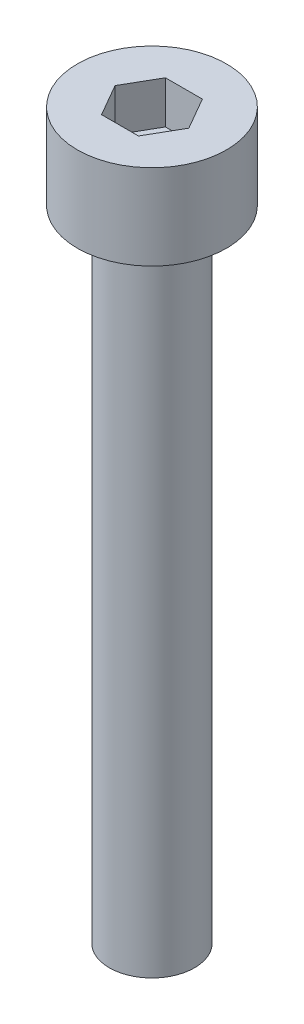
ISO-10303-21;
HEADER;
FILE_DESCRIPTION(('STEP AP214'),'2;1');
FILE_NAME('part.step','',(''),(''),'','','');
FILE_SCHEMA(('AUTOMOTIVE_DESIGN { 1 0 10303 214 1 1 1 1 }'));
ENDSEC;
DATA;
#1=APPLICATION_CONTEXT('core data for automotive mechanical design processes');
#2=APPLICATION_PROTOCOL_DEFINITION('international standard','automotive_design',2000,#1);
#3=PRODUCT_CONTEXT('',#1,'mechanical');
#4=PRODUCT('Part','Part','',(#3));
#5=PRODUCT_RELATED_PRODUCT_CATEGORY('part','',(#4));
#6=PRODUCT_DEFINITION_FORMATION('','',#4);
#7=PRODUCT_DEFINITION_CONTEXT('part definition',#1,'design');
#8=PRODUCT_DEFINITION('design','',#6,#7);
#9=PRODUCT_DEFINITION_SHAPE('','',#8);
#10=(LENGTH_UNIT() NAMED_UNIT(*) SI_UNIT(.MILLI.,.METRE.));
#11=(NAMED_UNIT(*) PLANE_ANGLE_UNIT() SI_UNIT($,.RADIAN.));
#12=(NAMED_UNIT(*) SI_UNIT($,.STERADIAN.) SOLID_ANGLE_UNIT());
#13=UNCERTAINTY_MEASURE_WITH_UNIT(LENGTH_MEASURE(1.E-05),#10,'distance_accuracy_value','');
#14=(GEOMETRIC_REPRESENTATION_CONTEXT(3) GLOBAL_UNCERTAINTY_ASSIGNED_CONTEXT((#13)) GLOBAL_UNIT_ASSIGNED_CONTEXT((#10,
#11,#12)) REPRESENTATION_CONTEXT('',''));
#15=CARTESIAN_POINT('',(0.,0.,0.));
#16=DIRECTION('',(0.,0.,1.));
#17=DIRECTION('',(1.,0.,0.));
#18=AXIS2_PLACEMENT_3D('',#15,#16,#17);
#19=CARTESIAN_POINT('',(0.,4.,0.));
#20=DIRECTION('',(0.,-1.,0.));
#21=DIRECTION('',(0.,0.,-1.));
#22=AXIS2_PLACEMENT_3D('',#19,#20,#21);
#23=PLANE('',#22);
#24=DIRECTION('',(-0.5,0.,-0.866025403784438));
#25=VECTOR('',#24,1.);
#26=CARTESIAN_POINT('',(1.73205080756888,4.,0.));
#27=LINE('',#26,#25);
#28=CARTESIAN_POINT('',(1.73205080756888,4.,0.));
#29=VERTEX_POINT('',#28);
#30=CARTESIAN_POINT('',(0.866025403784438,4.,-1.5));
#31=VERTEX_POINT('',#30);
#32=EDGE_CURVE('E122',#29,#31,#27,.T.);
#33=ORIENTED_EDGE('',*,*,#32,.F.);
#34=DIRECTION('',(0.5,0.,-0.866025403784439));
#35=VECTOR('',#34,1.);
#36=CARTESIAN_POINT('',(0.866025403784439,4.,1.5));
#37=LINE('',#36,#35);
#38=CARTESIAN_POINT('',(0.866025403784439,4.,1.5));
#39=VERTEX_POINT('',#38);
#40=EDGE_CURVE('E48',#39,#29,#37,.T.);
#41=ORIENTED_EDGE('',*,*,#40,.F.);
#42=DIRECTION('',(1.,0.,0.));
#43=VECTOR('',#42,1.);
#44=CARTESIAN_POINT('',(-0.866025403784439,4.,1.5));
#45=LINE('',#44,#43);
#46=CARTESIAN_POINT('',(-0.866025403784439,4.,1.5));
#47=VERTEX_POINT('',#46);
#48=EDGE_CURVE('E131',#47,#39,#45,.T.);
#49=ORIENTED_EDGE('',*,*,#48,.F.);
#50=DIRECTION('',(0.5,0.,0.866025403784439));
#51=VECTOR('',#50,1.);
#52=CARTESIAN_POINT('',(-1.73205080756888,4.,0.));
#53=LINE('',#52,#51);
#54=CARTESIAN_POINT('',(-1.73205080756888,4.,0.));
#55=VERTEX_POINT('',#54);
#56=EDGE_CURVE('E129',#55,#47,#53,.T.);
#57=ORIENTED_EDGE('',*,*,#56,.F.);
#58=DIRECTION('',(-0.5,0.,0.866025403784439));
#59=VECTOR('',#58,1.);
#60=CARTESIAN_POINT('',(-0.866025403784438,4.,-1.5));
#61=LINE('',#60,#59);
#62=CARTESIAN_POINT('',(-0.866025403784438,4.,-1.5));
#63=VERTEX_POINT('',#62);
#64=EDGE_CURVE('E96',#63,#55,#61,.T.);
#65=ORIENTED_EDGE('',*,*,#64,.F.);
#66=DIRECTION('',(-1.,0.,0.));
#67=VECTOR('',#66,1.);
#68=CARTESIAN_POINT('',(0.866025403784438,4.,-1.5));
#69=LINE('',#68,#67);
#70=EDGE_CURVE('E125',#31,#63,#69,.T.);
#71=ORIENTED_EDGE('',*,*,#70,.F.);
#72=EDGE_LOOP('',(#33,#41,#49,#57,#65,#71));
#73=FACE_BOUND('',#72,.T.);
#74=CARTESIAN_POINT('',(0.,4.,0.));
#75=DIRECTION('',(0.,1.,0.));
#76=DIRECTION('',(0.,0.,1.));
#77=AXIS2_PLACEMENT_3D('',#74,#75,#76);
#78=CIRCLE('',#77,3.5);
#79=CARTESIAN_POINT('',(0.,4.,3.5));
#80=VERTEX_POINT('',#79);
#81=EDGE_CURVE('E11',#80,#80,#78,.T.);
#82=ORIENTED_EDGE('',*,*,#81,.T.);
#83=EDGE_LOOP('',(#82));
#84=FACE_BOUND('',#83,.T.);
#85=ADVANCED_FACE('F34',(#73,#84),#23,.F.);
#86=CARTESIAN_POINT('',(0.,0.,0.));
#87=DIRECTION('',(0.,1.,0.));
#88=DIRECTION('',(0.,0.,1.));
#89=AXIS2_PLACEMENT_3D('',#86,#87,#88);
#90=CYLINDRICAL_SURFACE('',#89,3.5);
#91=ORIENTED_EDGE('',*,*,#81,.F.);
#92=EDGE_LOOP('',(#91));
#93=FACE_BOUND('',#92,.T.);
#94=CARTESIAN_POINT('',(0.,0.,0.));
#95=DIRECTION('',(0.,1.,0.));
#96=DIRECTION('',(0.,0.,1.));
#97=AXIS2_PLACEMENT_3D('',#94,#95,#96);
#98=CIRCLE('',#97,3.5);
#99=CARTESIAN_POINT('',(0.,0.,3.5));
#100=VERTEX_POINT('',#99);
#101=EDGE_CURVE('E41',#100,#100,#98,.T.);
#102=ORIENTED_EDGE('',*,*,#101,.T.);
#103=EDGE_LOOP('',(#102));
#104=FACE_BOUND('',#103,.T.);
#105=ADVANCED_FACE('F148',(#93,#104),#90,.T.);
#106=CARTESIAN_POINT('',(2.00000000000001,0.,0.));
#107=DIRECTION('',(0.,1.,0.));
#108=DIRECTION('',(0.,0.,1.));
#109=AXIS2_PLACEMENT_3D('',#106,#107,#108);
#110=PLANE('',#109);
#111=ORIENTED_EDGE('',*,*,#101,.F.);
#112=EDGE_LOOP('',(#111));
#113=FACE_BOUND('',#112,.T.);
#114=CARTESIAN_POINT('',(0.,0.,0.));
#115=DIRECTION('',(0.,1.,0.));
#116=DIRECTION('',(0.,0.,1.));
#117=AXIS2_PLACEMENT_3D('',#114,#115,#116);
#118=CIRCLE('',#117,2.00000000000001);
#119=CARTESIAN_POINT('',(0.,0.,2.00000000000001));
#120=VERTEX_POINT('',#119);
#121=EDGE_CURVE('E143',#120,#120,#118,.T.);
#122=ORIENTED_EDGE('',*,*,#121,.T.);
#123=EDGE_LOOP('',(#122));
#124=FACE_BOUND('',#123,.T.);
#125=ADVANCED_FACE('F150',(#113,#124),#110,.F.);
#126=CARTESIAN_POINT('',(0.,0.,0.));
#127=DIRECTION('',(0.,1.,0.));
#128=DIRECTION('',(0.,0.,1.));
#129=AXIS2_PLACEMENT_3D('',#126,#127,#128);
#130=CYLINDRICAL_SURFACE('',#129,2.00000000000001);
#131=ORIENTED_EDGE('',*,*,#121,.F.);
#132=EDGE_LOOP('',(#131));
#133=FACE_BOUND('',#132,.T.);
#134=CARTESIAN_POINT('',(0.,-30.,0.));
#135=DIRECTION('',(0.,1.,0.));
#136=DIRECTION('',(0.,0.,1.));
#137=AXIS2_PLACEMENT_3D('',#134,#135,#136);
#138=CIRCLE('',#137,2.00000000000001);
#139=CARTESIAN_POINT('',(0.,-30.,2.00000000000001));
#140=VERTEX_POINT('',#139);
#141=EDGE_CURVE('E135',#140,#140,#138,.T.);
#142=ORIENTED_EDGE('',*,*,#141,.T.);
#143=EDGE_LOOP('',(#142));
#144=FACE_BOUND('',#143,.T.);
#145=ADVANCED_FACE('F153',(#133,#144),#130,.T.);
#146=CARTESIAN_POINT('',(0.,-30.,0.));
#147=DIRECTION('',(0.,1.,0.));
#148=DIRECTION('',(0.,0.,1.));
#149=AXIS2_PLACEMENT_3D('',#146,#147,#148);
#150=PLANE('',#149);
#151=ORIENTED_EDGE('',*,*,#141,.F.);
#152=EDGE_LOOP('',(#151));
#153=FACE_BOUND('',#152,.T.);
#154=ADVANCED_FACE('F159',(#153),#150,.F.);
#155=CARTESIAN_POINT('',(0.866025403784439,2.,1.5));
#156=DIRECTION('',(0.866025403784439,0.,0.5));
#157=DIRECTION('',(0.5,0.,-0.866025403784439));
#158=AXIS2_PLACEMENT_3D('',#155,#156,#157);
#159=PLANE('',#158);
#160=ORIENTED_EDGE('',*,*,#40,.T.);
#161=DIRECTION('',(0.,1.,0.));
#162=VECTOR('',#161,1.);
#163=CARTESIAN_POINT('',(1.73205080756888,2.,0.));
#164=LINE('',#163,#162);
#165=CARTESIAN_POINT('',(1.73205080756888,2.,0.));
#166=VERTEX_POINT('',#165);
#167=EDGE_CURVE('E78',#166,#29,#164,.T.);
#168=ORIENTED_EDGE('',*,*,#167,.F.);
#169=DIRECTION('',(0.5,0.,-0.866025403784439));
#170=VECTOR('',#169,1.);
#171=CARTESIAN_POINT('',(0.866025403784439,2.,1.5));
#172=LINE('',#171,#170);
#173=CARTESIAN_POINT('',(0.866025403784439,2.,1.5));
#174=VERTEX_POINT('',#173);
#175=EDGE_CURVE('E133',#174,#166,#172,.T.);
#176=ORIENTED_EDGE('',*,*,#175,.F.);
#177=DIRECTION('',(0.,1.,0.));
#178=VECTOR('',#177,1.);
#179=CARTESIAN_POINT('',(0.866025403784439,2.,1.5));
#180=LINE('',#179,#178);
#181=EDGE_CURVE('E56',#174,#39,#180,.T.);
#182=ORIENTED_EDGE('',*,*,#181,.T.);
#183=EDGE_LOOP('',(#160,#168,#176,#182));
#184=FACE_BOUND('',#183,.T.);
#185=ADVANCED_FACE('F164',(#184),#159,.F.);
#186=CARTESIAN_POINT('',(-0.866025403784439,2.,1.5));
#187=DIRECTION('',(0.,0.,1.));
#188=DIRECTION('',(1.,0.,0.));
#189=AXIS2_PLACEMENT_3D('',#186,#187,#188);
#190=PLANE('',#189);
#191=ORIENTED_EDGE('',*,*,#48,.T.);
#192=ORIENTED_EDGE('',*,*,#181,.F.);
#193=DIRECTION('',(1.,0.,0.));
#194=VECTOR('',#193,1.);
#195=CARTESIAN_POINT('',(-0.866025403784439,2.,1.5));
#196=LINE('',#195,#194);
#197=CARTESIAN_POINT('',(-0.866025403784439,2.,1.5));
#198=VERTEX_POINT('',#197);
#199=EDGE_CURVE('E108',#198,#174,#196,.T.);
#200=ORIENTED_EDGE('',*,*,#199,.F.);
#201=DIRECTION('',(0.,1.,0.));
#202=VECTOR('',#201,1.);
#203=CARTESIAN_POINT('',(-0.866025403784439,2.,1.5));
#204=LINE('',#203,#202);
#205=EDGE_CURVE('E100',#198,#47,#204,.T.);
#206=ORIENTED_EDGE('',*,*,#205,.T.);
#207=EDGE_LOOP('',(#191,#192,#200,#206));
#208=FACE_BOUND('',#207,.T.);
#209=ADVANCED_FACE('F169',(#208),#190,.F.);
#210=CARTESIAN_POINT('',(-1.73205080756888,2.,0.));
#211=DIRECTION('',(-0.866025403784439,0.,0.5));
#212=DIRECTION('',(0.5,0.,0.866025403784439));
#213=AXIS2_PLACEMENT_3D('',#210,#211,#212);
#214=PLANE('',#213);
#215=ORIENTED_EDGE('',*,*,#56,.T.);
#216=ORIENTED_EDGE('',*,*,#205,.F.);
#217=DIRECTION('',(0.5,0.,0.866025403784439));
#218=VECTOR('',#217,1.);
#219=CARTESIAN_POINT('',(-1.73205080756888,2.,0.));
#220=LINE('',#219,#218);
#221=CARTESIAN_POINT('',(-1.73205080756888,2.,0.));
#222=VERTEX_POINT('',#221);
#223=EDGE_CURVE('E104',#222,#198,#220,.T.);
#224=ORIENTED_EDGE('',*,*,#223,.F.);
#225=DIRECTION('',(0.,1.,0.));
#226=VECTOR('',#225,1.);
#227=CARTESIAN_POINT('',(-1.73205080756888,2.,0.));
#228=LINE('',#227,#226);
#229=EDGE_CURVE('E89',#222,#55,#228,.T.);
#230=ORIENTED_EDGE('',*,*,#229,.T.);
#231=EDGE_LOOP('',(#215,#216,#224,#230));
#232=FACE_BOUND('',#231,.T.);
#233=ADVANCED_FACE('F105',(#232),#214,.F.);
#234=CARTESIAN_POINT('',(-0.866025403784438,2.,-1.5));
#235=DIRECTION('',(-0.866025403784439,0.,-0.5));
#236=DIRECTION('',(-0.5,0.,0.866025403784439));
#237=AXIS2_PLACEMENT_3D('',#234,#235,#236);
#238=PLANE('',#237);
#239=ORIENTED_EDGE('',*,*,#64,.T.);
#240=ORIENTED_EDGE('',*,*,#229,.F.);
#241=DIRECTION('',(-0.5,0.,0.866025403784439));
#242=VECTOR('',#241,1.);
#243=CARTESIAN_POINT('',(-0.866025403784438,2.,-1.5));
#244=LINE('',#243,#242);
#245=CARTESIAN_POINT('',(-0.866025403784438,2.,-1.5));
#246=VERTEX_POINT('',#245);
#247=EDGE_CURVE('E93',#246,#222,#244,.T.);
#248=ORIENTED_EDGE('',*,*,#247,.F.);
#249=DIRECTION('',(0.,1.,0.));
#250=VECTOR('',#249,1.);
#251=CARTESIAN_POINT('',(-0.866025403784438,2.,-1.5));
#252=LINE('',#251,#250);
#253=EDGE_CURVE('E101',#246,#63,#252,.T.);
#254=ORIENTED_EDGE('',*,*,#253,.T.);
#255=EDGE_LOOP('',(#239,#240,#248,#254));
#256=FACE_BOUND('',#255,.T.);
#257=ADVANCED_FACE('F91',(#256),#238,.F.);
#258=CARTESIAN_POINT('',(0.866025403784438,2.,-1.5));
#259=DIRECTION('',(0.,0.,-1.));
#260=DIRECTION('',(-1.,0.,0.));
#261=AXIS2_PLACEMENT_3D('',#258,#259,#260);
#262=PLANE('',#261);
#263=ORIENTED_EDGE('',*,*,#70,.T.);
#264=ORIENTED_EDGE('',*,*,#253,.F.);
#265=DIRECTION('',(-1.,0.,0.));
#266=VECTOR('',#265,1.);
#267=CARTESIAN_POINT('',(0.866025403784438,2.,-1.5));
#268=LINE('',#267,#266);
#269=CARTESIAN_POINT('',(0.866025403784438,2.,-1.5));
#270=VERTEX_POINT('',#269);
#271=EDGE_CURVE('E114',#270,#246,#268,.T.);
#272=ORIENTED_EDGE('',*,*,#271,.F.);
#273=DIRECTION('',(0.,1.,0.));
#274=VECTOR('',#273,1.);
#275=CARTESIAN_POINT('',(0.866025403784438,2.,-1.5));
#276=LINE('',#275,#274);
#277=EDGE_CURVE('E138',#270,#31,#276,.T.);
#278=ORIENTED_EDGE('',*,*,#277,.T.);
#279=EDGE_LOOP('',(#263,#264,#272,#278));
#280=FACE_BOUND('',#279,.T.);
#281=ADVANCED_FACE('F195',(#280),#262,.F.);
#282=CARTESIAN_POINT('',(1.73205080756888,2.,0.));
#283=DIRECTION('',(0.866025403784438,0.,-0.5));
#284=DIRECTION('',(-0.5,0.,-0.866025403784438));
#285=AXIS2_PLACEMENT_3D('',#282,#283,#284);
#286=PLANE('',#285);
#287=ORIENTED_EDGE('',*,*,#32,.T.);
#288=ORIENTED_EDGE('',*,*,#277,.F.);
#289=DIRECTION('',(-0.5,0.,-0.866025403784438));
#290=VECTOR('',#289,1.);
#291=CARTESIAN_POINT('',(1.73205080756888,2.,0.));
#292=LINE('',#291,#290);
#293=EDGE_CURVE('E116',#166,#270,#292,.T.);
#294=ORIENTED_EDGE('',*,*,#293,.F.);
#295=ORIENTED_EDGE('',*,*,#167,.T.);
#296=EDGE_LOOP('',(#287,#288,#294,#295));
#297=FACE_BOUND('',#296,.T.);
#298=ADVANCED_FACE('F183',(#297),#286,.F.);
#299=CARTESIAN_POINT('',(0.,2.,0.));
#300=DIRECTION('',(0.,1.,0.));
#301=DIRECTION('',(0.,0.,1.));
#302=AXIS2_PLACEMENT_3D('',#299,#300,#301);
#303=PLANE('',#302);
#304=ORIENTED_EDGE('',*,*,#175,.T.);
#305=ORIENTED_EDGE('',*,*,#293,.T.);
#306=ORIENTED_EDGE('',*,*,#271,.T.);
#307=ORIENTED_EDGE('',*,*,#247,.T.);
#308=ORIENTED_EDGE('',*,*,#223,.T.);
#309=ORIENTED_EDGE('',*,*,#199,.T.);
#310=EDGE_LOOP('',(#304,#305,#306,#307,#308,#309));
#311=FACE_BOUND('',#310,.T.);
#312=ADVANCED_FACE('F111',(#311),#303,.T.);
#313=CLOSED_SHELL('',(#85,#105,#125,#145,#154,#185,#209,#233,#257,#281,#298,#312));
#314=MANIFOLD_SOLID_BREP('B2',#313);
#315=ADVANCED_BREP_SHAPE_REPRESENTATION('',(#18,#314),#14);
#316=SHAPE_DEFINITION_REPRESENTATION(#9,#315);
ENDSEC;
END-ISO-10303-21;
